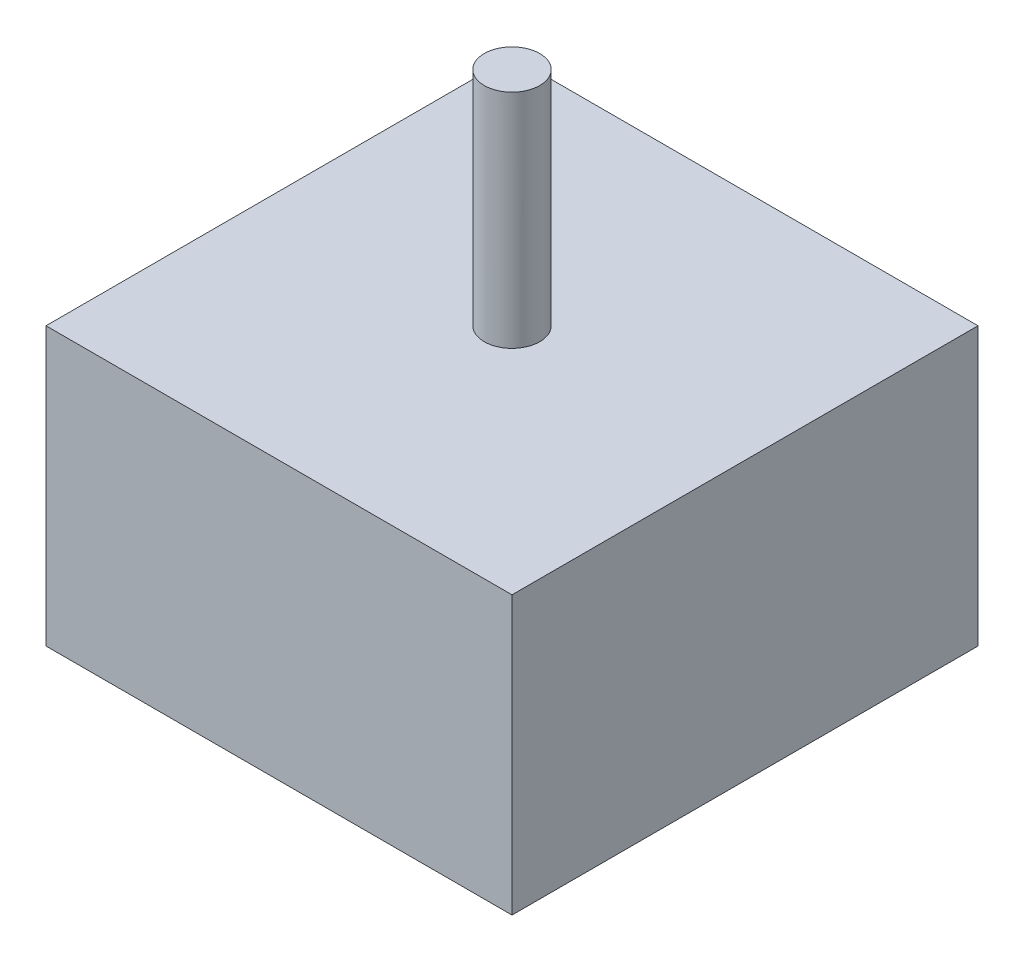
ISO-10303-21;
HEADER;
FILE_DESCRIPTION(('STEP AP214'),'2;1');
FILE_NAME('part.step','',(''),(''),'','','');
FILE_SCHEMA(('AUTOMOTIVE_DESIGN { 1 0 10303 214 1 1 1 1 }'));
ENDSEC;
DATA;
#1=APPLICATION_CONTEXT('core data for automotive mechanical design processes');
#2=APPLICATION_PROTOCOL_DEFINITION('international standard','automotive_design',2000,#1);
#3=PRODUCT_CONTEXT('',#1,'mechanical');
#4=PRODUCT('Part','Part','',(#3));
#5=PRODUCT_RELATED_PRODUCT_CATEGORY('part','',(#4));
#6=PRODUCT_DEFINITION_FORMATION('','',#4);
#7=PRODUCT_DEFINITION_CONTEXT('part definition',#1,'design');
#8=PRODUCT_DEFINITION('design','',#6,#7);
#9=PRODUCT_DEFINITION_SHAPE('','',#8);
#10=(LENGTH_UNIT() NAMED_UNIT(*) SI_UNIT(.MILLI.,.METRE.));
#11=(NAMED_UNIT(*) PLANE_ANGLE_UNIT() SI_UNIT($,.RADIAN.));
#12=(NAMED_UNIT(*) SI_UNIT($,.STERADIAN.) SOLID_ANGLE_UNIT());
#13=UNCERTAINTY_MEASURE_WITH_UNIT(LENGTH_MEASURE(1.E-05),#10,'distance_accuracy_value','');
#14=(GEOMETRIC_REPRESENTATION_CONTEXT(3) GLOBAL_UNCERTAINTY_ASSIGNED_CONTEXT((#13)) GLOBAL_UNIT_ASSIGNED_CONTEXT((#10,
#11,#12)) REPRESENTATION_CONTEXT('',''));
#15=CARTESIAN_POINT('',(0.,0.,0.));
#16=DIRECTION('',(0.,0.,1.));
#17=DIRECTION('',(1.,0.,0.));
#18=AXIS2_PLACEMENT_3D('',#15,#16,#17);
#19=CARTESIAN_POINT('',(21.,25.,21.));
#20=DIRECTION('',(-1.,0.,0.));
#21=DIRECTION('',(0.,0.,1.));
#22=AXIS2_PLACEMENT_3D('',#19,#20,#21);
#23=PLANE('',#22);
#24=DIRECTION('',(0.,0.,-1.));
#25=VECTOR('',#24,1.);
#26=CARTESIAN_POINT('',(21.,0.,21.));
#27=LINE('',#26,#25);
#28=CARTESIAN_POINT('',(21.,0.,21.));
#29=VERTEX_POINT('',#28);
#30=CARTESIAN_POINT('',(21.,0.,-21.));
#31=VERTEX_POINT('',#30);
#32=EDGE_CURVE('E116',#29,#31,#27,.T.);
#33=ORIENTED_EDGE('',*,*,#32,.T.);
#34=DIRECTION('',(0.,-1.,0.));
#35=VECTOR('',#34,1.);
#36=CARTESIAN_POINT('',(21.,25.,-21.));
#37=LINE('',#36,#35);
#38=CARTESIAN_POINT('',(21.,25.,-21.));
#39=VERTEX_POINT('',#38);
#40=EDGE_CURVE('E54',#39,#31,#37,.T.);
#41=ORIENTED_EDGE('',*,*,#40,.F.);
#42=DIRECTION('',(0.,0.,-1.));
#43=VECTOR('',#42,1.);
#44=CARTESIAN_POINT('',(21.,25.,21.));
#45=LINE('',#44,#43);
#46=CARTESIAN_POINT('',(21.,25.,21.));
#47=VERTEX_POINT('',#46);
#48=EDGE_CURVE('E98',#47,#39,#45,.T.);
#49=ORIENTED_EDGE('',*,*,#48,.F.);
#50=DIRECTION('',(0.,-1.,0.));
#51=VECTOR('',#50,1.);
#52=CARTESIAN_POINT('',(21.,25.,21.));
#53=LINE('',#52,#51);
#54=EDGE_CURVE('E112',#47,#29,#53,.T.);
#55=ORIENTED_EDGE('',*,*,#54,.T.);
#56=EDGE_LOOP('',(#33,#41,#49,#55));
#57=FACE_BOUND('',#56,.T.);
#58=ADVANCED_FACE('F45',(#57),#23,.F.);
#59=CARTESIAN_POINT('',(-21.,25.,-21.));
#60=DIRECTION('',(0.,0.,1.));
#61=DIRECTION('',(1.,0.,0.));
#62=AXIS2_PLACEMENT_3D('',#59,#60,#61);
#63=PLANE('',#62);
#64=DIRECTION('',(-1.,0.,0.));
#65=VECTOR('',#64,1.);
#66=CARTESIAN_POINT('',(-21.,0.,-21.));
#67=LINE('',#66,#65);
#68=CARTESIAN_POINT('',(-21.,0.,-21.));
#69=VERTEX_POINT('',#68);
#70=EDGE_CURVE('E104',#31,#69,#67,.T.);
#71=ORIENTED_EDGE('',*,*,#70,.T.);
#72=DIRECTION('',(0.,-1.,0.));
#73=VECTOR('',#72,1.);
#74=CARTESIAN_POINT('',(-21.,25.,-21.));
#75=LINE('',#74,#73);
#76=CARTESIAN_POINT('',(-21.,25.,-21.));
#77=VERTEX_POINT('',#76);
#78=EDGE_CURVE('E102',#77,#69,#75,.T.);
#79=ORIENTED_EDGE('',*,*,#78,.F.);
#80=DIRECTION('',(-1.,0.,0.));
#81=VECTOR('',#80,1.);
#82=CARTESIAN_POINT('',(-21.,25.,-21.));
#83=LINE('',#82,#81);
#84=EDGE_CURVE('E93',#39,#77,#83,.T.);
#85=ORIENTED_EDGE('',*,*,#84,.F.);
#86=ORIENTED_EDGE('',*,*,#40,.T.);
#87=EDGE_LOOP('',(#71,#79,#85,#86));
#88=FACE_BOUND('',#87,.T.);
#89=ADVANCED_FACE('F103',(#88),#63,.F.);
#90=CARTESIAN_POINT('',(-21.,25.,21.));
#91=DIRECTION('',(1.,0.,0.));
#92=DIRECTION('',(0.,0.,-1.));
#93=AXIS2_PLACEMENT_3D('',#90,#91,#92);
#94=PLANE('',#93);
#95=DIRECTION('',(0.,0.,1.));
#96=VECTOR('',#95,1.);
#97=CARTESIAN_POINT('',(-21.,0.,21.));
#98=LINE('',#97,#96);
#99=CARTESIAN_POINT('',(-21.,0.,21.));
#100=VERTEX_POINT('',#99);
#101=EDGE_CURVE('E79',#69,#100,#98,.T.);
#102=ORIENTED_EDGE('',*,*,#101,.T.);
#103=DIRECTION('',(0.,-1.,0.));
#104=VECTOR('',#103,1.);
#105=CARTESIAN_POINT('',(-21.,25.,21.));
#106=LINE('',#105,#104);
#107=CARTESIAN_POINT('',(-21.,25.,21.));
#108=VERTEX_POINT('',#107);
#109=EDGE_CURVE('E106',#108,#100,#106,.T.);
#110=ORIENTED_EDGE('',*,*,#109,.F.);
#111=DIRECTION('',(0.,0.,1.));
#112=VECTOR('',#111,1.);
#113=CARTESIAN_POINT('',(-21.,25.,21.));
#114=LINE('',#113,#112);
#115=EDGE_CURVE('E96',#77,#108,#114,.T.);
#116=ORIENTED_EDGE('',*,*,#115,.F.);
#117=ORIENTED_EDGE('',*,*,#78,.T.);
#118=EDGE_LOOP('',(#102,#110,#116,#117));
#119=FACE_BOUND('',#118,.T.);
#120=ADVANCED_FACE('F108',(#119),#94,.F.);
#121=CARTESIAN_POINT('',(-21.,25.,21.));
#122=DIRECTION('',(0.,0.,-1.));
#123=DIRECTION('',(-1.,0.,0.));
#124=AXIS2_PLACEMENT_3D('',#121,#122,#123);
#125=PLANE('',#124);
#126=DIRECTION('',(1.,0.,0.));
#127=VECTOR('',#126,1.);
#128=CARTESIAN_POINT('',(-21.,0.,21.));
#129=LINE('',#128,#127);
#130=EDGE_CURVE('E85',#100,#29,#129,.T.);
#131=ORIENTED_EDGE('',*,*,#130,.T.);
#132=ORIENTED_EDGE('',*,*,#54,.F.);
#133=DIRECTION('',(1.,0.,0.));
#134=VECTOR('',#133,1.);
#135=CARTESIAN_POINT('',(-21.,25.,21.));
#136=LINE('',#135,#134);
#137=EDGE_CURVE('E62',#108,#47,#136,.T.);
#138=ORIENTED_EDGE('',*,*,#137,.F.);
#139=ORIENTED_EDGE('',*,*,#109,.T.);
#140=EDGE_LOOP('',(#131,#132,#138,#139));
#141=FACE_BOUND('',#140,.T.);
#142=ADVANCED_FACE('F146',(#141),#125,.F.);
#143=CARTESIAN_POINT('',(0.,25.,0.));
#144=DIRECTION('',(0.,-1.,0.));
#145=DIRECTION('',(0.,0.,-1.));
#146=AXIS2_PLACEMENT_3D('',#143,#144,#145);
#147=PLANE('',#146);
#148=CARTESIAN_POINT('',(0.,25.,0.));
#149=DIRECTION('',(0.,-1.,0.));
#150=DIRECTION('',(0.,0.,-1.));
#151=AXIS2_PLACEMENT_3D('',#148,#149,#150);
#152=CIRCLE('',#151,2.5);
#153=CARTESIAN_POINT('',(0.,25.,-2.5));
#154=VERTEX_POINT('',#153);
#155=EDGE_CURVE('E11',#154,#154,#152,.F.);
#156=ORIENTED_EDGE('',*,*,#155,.F.);
#157=EDGE_LOOP('',(#156));
#158=FACE_BOUND('',#157,.T.);
#159=ORIENTED_EDGE('',*,*,#48,.T.);
#160=ORIENTED_EDGE('',*,*,#84,.T.);
#161=ORIENTED_EDGE('',*,*,#115,.T.);
#162=ORIENTED_EDGE('',*,*,#137,.T.);
#163=EDGE_LOOP('',(#159,#160,#161,#162));
#164=FACE_BOUND('',#163,.T.);
#165=ADVANCED_FACE('F94',(#158,#164),#147,.F.);
#166=CARTESIAN_POINT('',(0.,0.,0.));
#167=DIRECTION('',(0.,-1.,0.));
#168=DIRECTION('',(0.,0.,-1.));
#169=AXIS2_PLACEMENT_3D('',#166,#167,#168);
#170=PLANE('',#169);
#171=ORIENTED_EDGE('',*,*,#32,.F.);
#172=ORIENTED_EDGE('',*,*,#130,.F.);
#173=ORIENTED_EDGE('',*,*,#101,.F.);
#174=ORIENTED_EDGE('',*,*,#70,.F.);
#175=EDGE_LOOP('',(#171,#172,#173,#174));
#176=FACE_BOUND('',#175,.T.);
#177=ADVANCED_FACE('F134',(#176),#170,.T.);
#178=CARTESIAN_POINT('',(0.,45.,0.));
#179=DIRECTION('',(0.,-1.,0.));
#180=DIRECTION('',(0.,0.,-1.));
#181=AXIS2_PLACEMENT_3D('',#178,#179,#180);
#182=CYLINDRICAL_SURFACE('',#181,2.5);
#183=CARTESIAN_POINT('',(0.,45.,0.));
#184=DIRECTION('',(0.,1.,0.));
#185=DIRECTION('',(0.,0.,1.));
#186=AXIS2_PLACEMENT_3D('',#183,#184,#185);
#187=CIRCLE('',#186,2.5);
#188=CARTESIAN_POINT('',(0.,45.,2.5));
#189=VERTEX_POINT('',#188);
#190=EDGE_CURVE('E120',#189,#189,#187,.T.);
#191=ORIENTED_EDGE('',*,*,#190,.F.);
#192=EDGE_LOOP('',(#191));
#193=FACE_BOUND('',#192,.T.);
#194=ORIENTED_EDGE('',*,*,#155,.T.);
#195=EDGE_LOOP('',(#194));
#196=FACE_BOUND('',#195,.T.);
#197=ADVANCED_FACE('F136',(#193,#196),#182,.T.);
#198=CARTESIAN_POINT('',(0.,45.,0.));
#199=DIRECTION('',(0.,1.,0.));
#200=DIRECTION('',(0.,0.,1.));
#201=AXIS2_PLACEMENT_3D('',#198,#199,#200);
#202=PLANE('',#201);
#203=ORIENTED_EDGE('',*,*,#190,.T.);
#204=EDGE_LOOP('',(#203));
#205=FACE_BOUND('',#204,.T.);
#206=ADVANCED_FACE('F143',(#205),#202,.T.);
#207=CLOSED_SHELL('',(#58,#89,#120,#142,#165,#177,#197,#206));
#208=MANIFOLD_SOLID_BREP('B2',#207);
#209=ADVANCED_BREP_SHAPE_REPRESENTATION('',(#18,#208),#14);
#210=SHAPE_DEFINITION_REPRESENTATION(#9,#209);
ENDSEC;
END-ISO-10303-21;
